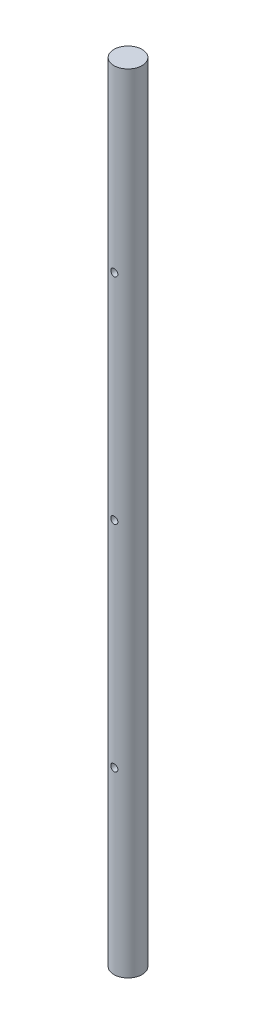
ISO-10303-21;
HEADER;
FILE_DESCRIPTION(('STEP AP214'),'2;1');
FILE_NAME('part.step','',(''),(''),'','','');
FILE_SCHEMA(('AUTOMOTIVE_DESIGN { 1 0 10303 214 1 1 1 1 }'));
ENDSEC;
DATA;
#1=APPLICATION_CONTEXT('core data for automotive mechanical design processes');
#2=APPLICATION_PROTOCOL_DEFINITION('international standard','automotive_design',2000,#1);
#3=PRODUCT_CONTEXT('',#1,'mechanical');
#4=PRODUCT('Part','Part','',(#3));
#5=PRODUCT_RELATED_PRODUCT_CATEGORY('part','',(#4));
#6=PRODUCT_DEFINITION_FORMATION('','',#4);
#7=PRODUCT_DEFINITION_CONTEXT('part definition',#1,'design');
#8=PRODUCT_DEFINITION('design','',#6,#7);
#9=PRODUCT_DEFINITION_SHAPE('','',#8);
#10=(LENGTH_UNIT() NAMED_UNIT(*) SI_UNIT(.MILLI.,.METRE.));
#11=(NAMED_UNIT(*) PLANE_ANGLE_UNIT() SI_UNIT($,.RADIAN.));
#12=(NAMED_UNIT(*) SI_UNIT($,.STERADIAN.) SOLID_ANGLE_UNIT());
#13=UNCERTAINTY_MEASURE_WITH_UNIT(LENGTH_MEASURE(1.E-05),#10,'distance_accuracy_value','');
#14=(GEOMETRIC_REPRESENTATION_CONTEXT(3) GLOBAL_UNCERTAINTY_ASSIGNED_CONTEXT((#13)) GLOBAL_UNIT_ASSIGNED_CONTEXT((#10,
#11,#12)) REPRESENTATION_CONTEXT('',''));
#15=CARTESIAN_POINT('',(0.,0.,0.));
#16=DIRECTION('',(0.,0.,1.));
#17=DIRECTION('',(1.,0.,0.));
#18=AXIS2_PLACEMENT_3D('',#15,#16,#17);
#19=CARTESIAN_POINT('',(0.,280.,0.));
#20=DIRECTION('',(0.,-1.,0.));
#21=DIRECTION('',(0.,0.,-1.));
#22=AXIS2_PLACEMENT_3D('',#19,#20,#21);
#23=CYLINDRICAL_SURFACE('',#22,5.);
#24=CARTESIAN_POINT('',(-1.25,63.75,4.84122918275927));
#25=CARTESIAN_POINT('',(-1.24999803929589,63.6809746245377,4.84123050042654));
#26=CARTESIAN_POINT('',(-1.24426312274865,63.611927550661,4.84272153006957));
#27=CARTESIAN_POINT('',(-1.22151156273207,63.475816210913,4.84850930996624));
#28=CARTESIAN_POINT('',(-1.2044883533711,63.4087531227658,4.85280769310907));
#29=CARTESIAN_POINT('',(-1.15974559981598,63.2785982309065,4.86369362297984));
#30=CARTESIAN_POINT('',(-1.13203986392723,63.2155014223072,4.87027821345204));
#31=CARTESIAN_POINT('',(-1.0667605706307,63.09484457373,4.88499096014404));
#32=CARTESIAN_POINT('',(-1.02918659428034,63.0372847689599,4.89311918189251));
#33=CARTESIAN_POINT('',(-0.944354213655933,62.9280691773689,4.91020358177806));
#34=CARTESIAN_POINT('',(-0.89691844385202,62.876553199825,4.91917298811515));
#35=CARTESIAN_POINT('',(-0.794091032050329,62.7821193028198,4.93681437757649));
#36=CARTESIAN_POINT('',(-0.738698647090153,62.7392021871891,4.94548633283195));
#37=CARTESIAN_POINT('',(-0.620572600539478,62.6626122661844,4.96170207760291));
#38=CARTESIAN_POINT('',(-0.55774728809756,62.6290768059193,4.96922843700296));
#39=CARTESIAN_POINT('',(-0.427131592146382,62.5730951779234,4.98215405962992));
#40=CARTESIAN_POINT('',(-0.359341942895973,62.5506473740422,4.98755363667172));
#41=CARTESIAN_POINT('',(-0.222179379377086,62.5179260827107,4.9955237942409));
#42=CARTESIAN_POINT('',(-0.152866359774494,62.5074151778367,4.99814946922157));
#43=CARTESIAN_POINT('',(-0.0134144096313922,62.4981208103622,5.00046797053649));
#44=CARTESIAN_POINT('',(0.0567243972690267,62.4993356138952,5.00016123048352));
#45=CARTESIAN_POINT('',(0.194190308965478,62.5132874251251,4.99669047476767));
#46=CARTESIAN_POINT('',(0.26154526950133,62.5257681625269,4.99359001170437));
#47=CARTESIAN_POINT('',(0.393172809267105,62.5614856350243,4.98495418262427));
#48=CARTESIAN_POINT('',(0.457445224213044,62.5847229426887,4.9794186869922));
#49=CARTESIAN_POINT('',(0.581758379377254,62.6415012853435,4.96643754850448));
#50=CARTESIAN_POINT('',(0.641755637208127,62.6751335223309,4.95897509847527));
#51=CARTESIAN_POINT('',(0.755344527925607,62.7516778395581,4.94294951904825));
#52=CARTESIAN_POINT('',(0.808935043856876,62.7945915342803,4.93438619826245));
#53=CARTESIAN_POINT('',(0.909717543856186,62.8898543709912,4.9168185688476));
#54=CARTESIAN_POINT('',(0.956697098843988,62.9424274461739,4.90780859762959));
#55=CARTESIAN_POINT('',(1.04122046995377,63.0547999867701,4.89057521758353));
#56=CARTESIAN_POINT('',(1.07876384505752,63.1145997897455,4.88235184552985));
#57=CARTESIAN_POINT('',(1.14348516127825,63.2401450170745,4.86760248415824));
#58=CARTESIAN_POINT('',(1.17061195871311,63.3059178651566,4.8610849186286));
#59=CARTESIAN_POINT('',(1.21335702579543,63.4412927340382,4.85059320069979));
#60=CARTESIAN_POINT('',(1.22897775819114,63.5108939319916,4.84661850405109));
#61=CARTESIAN_POINT('',(1.24791481933259,63.6499797507616,4.8417767801957));
#62=CARTESIAN_POINT('',(1.25154523695981,63.7194188966648,4.84083044546824));
#63=CARTESIAN_POINT('',(1.24725849525777,63.8579109682891,4.8419367174052));
#64=CARTESIAN_POINT('',(1.2393423989244,63.9269639289756,4.84398904800633));
#65=CARTESIAN_POINT('',(1.21246273196883,64.0615571324773,4.8507854097728));
#66=CARTESIAN_POINT('',(1.19368203414088,64.1271363632854,4.85548485117187));
#67=CARTESIAN_POINT('',(1.14580904083531,64.2542157289258,4.86700359135481));
#68=CARTESIAN_POINT('',(1.11671552385628,64.3157153795277,4.87382314124307));
#69=CARTESIAN_POINT('',(1.04838533396829,64.4342206389337,4.88898068546631));
#70=CARTESIAN_POINT('',(1.00896087691782,64.4911144200215,4.89734584303321));
#71=CARTESIAN_POINT('',(0.921325366168079,64.5975941814007,4.91458541535858));
#72=CARTESIAN_POINT('',(0.873112868506807,64.647178958325,4.92345991364235));
#73=CARTESIAN_POINT('',(0.767828401230913,64.7389055212855,4.94098701515803));
#74=CARTESIAN_POINT('',(0.710564940664495,64.7808300312744,4.94962851030918));
#75=CARTESIAN_POINT('',(0.589628353368347,64.8544679334756,4.96548608306867));
#76=CARTESIAN_POINT('',(0.525955561196992,64.8861818583041,4.9727022350198));
#77=CARTESIAN_POINT('',(0.394447752163868,64.938223017264,4.98485057869157));
#78=CARTESIAN_POINT('',(0.326646726284859,64.9586321421895,4.98979915011205));
#79=CARTESIAN_POINT('',(0.188437200398519,64.9877301673042,4.99692646697894));
#80=CARTESIAN_POINT('',(0.118029206301564,64.9964213293695,4.99910574696704));
#81=CARTESIAN_POINT('',(-0.0213544080541482,65.0017094869694,5.00042711761014));
#82=CARTESIAN_POINT('',(-0.0903172837075322,64.9986271363692,4.9996497360001));
#83=CARTESIAN_POINT('',(-0.226709370518417,64.9811902158821,4.9953237057178));
#84=CARTESIAN_POINT('',(-0.294138627226102,64.9668359812336,4.99177513946369));
#85=CARTESIAN_POINT('',(-0.425213794556015,64.9274347252863,4.98231791067453));
#86=CARTESIAN_POINT('',(-0.488878118226268,64.9024456833567,4.97642205628333));
#87=CARTESIAN_POINT('',(-0.611146316301831,64.8425367762258,4.9628911114173));
#88=CARTESIAN_POINT('',(-0.669749551581312,64.807615659163,4.9552558017217));
#89=CARTESIAN_POINT('',(-0.781752410529871,64.7278559575037,4.93884062101666));
#90=CARTESIAN_POINT('',(-0.834993735375724,64.6827998213658,4.93003771182014));
#91=CARTESIAN_POINT('',(-0.933268775339063,64.5844714350328,4.91238311316553));
#92=CARTESIAN_POINT('',(-0.978300406335232,64.5311971048776,4.90353141190695));
#93=CARTESIAN_POINT('',(-1.05970253309903,64.4167482322483,4.88659344825685));
#94=CARTESIAN_POINT('',(-1.09589577430819,64.3554448457342,4.87852454662356));
#95=CARTESIAN_POINT('',(-1.15740862076958,64.2274306375966,4.8642994443827));
#96=CARTESIAN_POINT('',(-1.18273613719965,64.1607237923666,4.85814185308378));
#97=CARTESIAN_POINT('',(-1.2180281607068,64.0367787352166,4.84939885924729));
#98=CARTESIAN_POINT('',(-1.22999146324423,63.9801335445202,4.84635828750683));
#99=CARTESIAN_POINT('',(-1.24597786571659,63.86566391375,4.84227298231965));
#100=CARTESIAN_POINT('',(-1.25000164296523,63.8078395746937,4.84122807862454));
#101=CARTESIAN_POINT('',(-1.25,63.75,4.84122918275927));
#102=B_SPLINE_CURVE_WITH_KNOTS('',3,(#24,#25,#26,#27,#28,#29,#30,#31,#32,#33,#34,#35,#36,#37,
#38,#39,#40,#41,#42,#43,#44,#45,#46,#47,#48,#49,#50,#51,#52,#53,#54,#55,#56,#57,#58,#59,#60,#61,
#62,#63,#64,#65,#66,#67,#68,#69,#70,#71,#72,#73,#74,#75,#76,#77,#78,#79,#80,#81,#82,#83,#84,#85,
#86,#87,#88,#89,#90,#91,#92,#93,#94,#95,#96,#97,#98,#99,#100,#101),.UNSPECIFIED.,.T.,.F.,(4,2,2,
2,2,2,2,2,2,2,2,2,2,2,2,2,2,2,2,2,2,2,2,2,2,2,2,2,2,2,2,2,2,2,2,2,2,2,4),(0.,0.206863720868061,
0.413847870714327,0.620565363583011,0.827291633777402,1.03811977096488,1.24896760739933,
1.46275748198961,1.67651579923546,1.88594375497673,2.0953407433301,2.30009131344473,
2.50485278362393,2.71146437127222,2.91811192734456,3.13035233285953,3.34260265599901,
3.55588216004201,3.76911600064774,3.97671787380859,4.184300635919,4.38848702504603,
4.59269760710707,4.80091422929578,5.00916509442522,5.2226266548266,5.43607707859776,
5.64796036403464,5.85980274454518,6.06591723063728,6.2720255868849,6.47702438279855,
6.68204902869036,6.89198548291035,7.10197515782755,7.31588238642339,7.5296336068331,
7.70298913588666,7.87632987549761),.UNSPECIFIED.);
#103=CARTESIAN_POINT('',(-1.25,63.75,4.84122918275927));
#104=VERTEX_POINT('',#103);
#105=EDGE_CURVE('E84',#104,#104,#102,.T.);
#106=ORIENTED_EDGE('',*,*,#105,.F.);
#107=EDGE_LOOP('',(#106));
#108=FACE_BOUND('',#107,.T.);
#109=CARTESIAN_POINT('',(-1.25,140.,4.84122918275927));
#110=CARTESIAN_POINT('',(-1.24999803929589,139.930974624538,4.84123050042654));
#111=CARTESIAN_POINT('',(-1.24426312274865,139.861927550661,4.84272153006957));
#112=CARTESIAN_POINT('',(-1.22151156273207,139.725816210913,4.84850930996624));
#113=CARTESIAN_POINT('',(-1.20448835337109,139.658753122766,4.85280769310907));
#114=CARTESIAN_POINT('',(-1.15974559981597,139.528598230906,4.86369362297984));
#115=CARTESIAN_POINT('',(-1.13203986392723,139.465501422307,4.87027821345204));
#116=CARTESIAN_POINT('',(-1.0667605706307,139.34484457373,4.88499096014404));
#117=CARTESIAN_POINT('',(-1.02918659428034,139.28728476896,4.89311918189251));
#118=CARTESIAN_POINT('',(-0.944354213655914,139.178069177369,4.91020358177806));
#119=CARTESIAN_POINT('',(-0.896918443851989,139.126553199825,4.91917298811516));
#120=CARTESIAN_POINT('',(-0.79409103205029,139.03211930282,4.93681437757649));
#121=CARTESIAN_POINT('',(-0.738698647090118,138.989202187189,4.94548633283195));
#122=CARTESIAN_POINT('',(-0.620572600539448,138.912612266184,4.96170207760291));
#123=CARTESIAN_POINT('',(-0.55774728809753,138.879076805919,4.96922843700296));
#124=CARTESIAN_POINT('',(-0.427131592146347,138.823095177923,4.98215405962992));
#125=CARTESIAN_POINT('',(-0.359341942895932,138.800647374042,4.98755363667173));
#126=CARTESIAN_POINT('',(-0.222179379377039,138.767926082711,4.9955237942409));
#127=CARTESIAN_POINT('',(-0.152866359774448,138.757415177837,4.99814946922157));
#128=CARTESIAN_POINT('',(-0.0134144096313476,138.748120810362,5.00046797053649));
#129=CARTESIAN_POINT('',(0.0567243972690697,138.749335613895,5.00016123048352));
#130=CARTESIAN_POINT('',(0.194190308965517,138.763287425125,4.99669047476767));
#131=CARTESIAN_POINT('',(0.261545269501366,138.775768162527,4.99359001170437));
#132=CARTESIAN_POINT('',(0.393172809267139,138.811485635024,4.98495418262427));
#133=CARTESIAN_POINT('',(0.457445224213079,138.834722942689,4.9794186869922));
#134=CARTESIAN_POINT('',(0.581758379377283,138.891501285344,4.96643754850447));
#135=CARTESIAN_POINT('',(0.641755637208149,138.925133522331,4.95897509847526));
#136=CARTESIAN_POINT('',(0.755344527925625,139.001677839558,4.94294951904824));
#137=CARTESIAN_POINT('',(0.808935043856899,139.04459153428,4.93438619826245));
#138=CARTESIAN_POINT('',(0.909717543856203,139.139854370991,4.9168185688476));
#139=CARTESIAN_POINT('',(0.956697098843997,139.192427446174,4.90780859762959));
#140=CARTESIAN_POINT('',(1.04122046995377,139.30479998677,4.89057521758353));
#141=CARTESIAN_POINT('',(1.07876384505752,139.364599789746,4.88235184552985));
#142=CARTESIAN_POINT('',(1.14348516127826,139.490145017075,4.86760248415824));
#143=CARTESIAN_POINT('',(1.17061195871312,139.555917865157,4.8610849186286));
#144=CARTESIAN_POINT('',(1.21335702579544,139.691292734038,4.85059320069978));
#145=CARTESIAN_POINT('',(1.22897775819115,139.760893931992,4.84661850405109));
#146=CARTESIAN_POINT('',(1.24791481933259,139.899979750762,4.8417767801957));
#147=CARTESIAN_POINT('',(1.25154523695981,139.969418896665,4.84083044546824));
#148=CARTESIAN_POINT('',(1.24725849525778,140.107910968289,4.8419367174052));
#149=CARTESIAN_POINT('',(1.2393423989244,140.176963928976,4.84398904800633));
#150=CARTESIAN_POINT('',(1.21246273196883,140.311557132477,4.8507854097728));
#151=CARTESIAN_POINT('',(1.19368203414087,140.377136363285,4.85548485117188));
#152=CARTESIAN_POINT('',(1.14580904083531,140.504215728926,4.86700359135481));
#153=CARTESIAN_POINT('',(1.11671552385627,140.565715379528,4.87382314124307));
#154=CARTESIAN_POINT('',(1.04838533396827,140.684220638934,4.88898068546632));
#155=CARTESIAN_POINT('',(1.0089608769178,140.741114420022,4.89734584303321));
#156=CARTESIAN_POINT('',(0.921325366168039,140.847594181401,4.91458541535859));
#157=CARTESIAN_POINT('',(0.873112868506763,140.897178958325,4.92345991364236));
#158=CARTESIAN_POINT('',(0.767828401230859,140.988905521286,4.94098701515804));
#159=CARTESIAN_POINT('',(0.71056494066444,141.030830031274,4.94962851030918));
#160=CARTESIAN_POINT('',(0.589628353368294,141.104467933476,4.96548608306868));
#161=CARTESIAN_POINT('',(0.525955561196943,141.136181858304,4.97270223501981));
#162=CARTESIAN_POINT('',(0.394447752163826,141.188223017264,4.98485057869157));
#163=CARTESIAN_POINT('',(0.326646726284819,141.20863214219,4.98979915011205));
#164=CARTESIAN_POINT('',(0.188437200398483,141.237730167304,4.99692646697894));
#165=CARTESIAN_POINT('',(0.11802920630153,141.24642132937,4.99910574696704));
#166=CARTESIAN_POINT('',(-0.0213544080541821,141.251709486969,5.00042711761014));
#167=CARTESIAN_POINT('',(-0.0903172837075666,141.248627136369,4.9996497360001));
#168=CARTESIAN_POINT('',(-0.226709370518452,141.231190215882,4.99532370571779));
#169=CARTESIAN_POINT('',(-0.294138627226137,141.216835981234,4.99177513946369));
#170=CARTESIAN_POINT('',(-0.425213794556048,141.177434725286,4.98231791067453));
#171=CARTESIAN_POINT('',(-0.4888781182263,141.152445683357,4.97642205628332));
#172=CARTESIAN_POINT('',(-0.61114631630186,141.092536776226,4.9628911114173));
#173=CARTESIAN_POINT('',(-0.669749551581339,141.057615659163,4.9552558017217));
#174=CARTESIAN_POINT('',(-0.781752410529897,140.977855957504,4.93884062101666));
#175=CARTESIAN_POINT('',(-0.834993735375754,140.932799821366,4.93003771182014));
#176=CARTESIAN_POINT('',(-0.933268775339092,140.834471435033,4.91238311316552));
#177=CARTESIAN_POINT('',(-0.978300406335258,140.781197104878,4.90353141190694));
#178=CARTESIAN_POINT('',(-1.05970253309906,140.666748232248,4.88659344825685));
#179=CARTESIAN_POINT('',(-1.09589577430821,140.605444845734,4.87852454662355));
#180=CARTESIAN_POINT('',(-1.1574086207696,140.477430637597,4.86429944438269));
#181=CARTESIAN_POINT('',(-1.18273613719966,140.410723792367,4.85814185308378));
#182=CARTESIAN_POINT('',(-1.2180281607068,140.286778735217,4.84939885924729));
#183=CARTESIAN_POINT('',(-1.22999146324423,140.23013354452,4.84635828750683));
#184=CARTESIAN_POINT('',(-1.24597786571659,140.11566391375,4.84227298231965));
#185=CARTESIAN_POINT('',(-1.25000164296523,140.057839574694,4.84122807862454));
#186=CARTESIAN_POINT('',(-1.25,140.,4.84122918275927));
#187=B_SPLINE_CURVE_WITH_KNOTS('',3,(#109,#110,#111,#112,#113,#114,#115,#116,#117,#118,#119,
#120,#121,#122,#123,#124,#125,#126,#127,#128,#129,#130,#131,#132,#133,#134,#135,#136,#137,#138,
#139,#140,#141,#142,#143,#144,#145,#146,#147,#148,#149,#150,#151,#152,#153,#154,#155,#156,#157,
#158,#159,#160,#161,#162,#163,#164,#165,#166,#167,#168,#169,#170,#171,#172,#173,#174,#175,#176,
#177,#178,#179,#180,#181,#182,#183,#184,#185,#186),.UNSPECIFIED.,.T.,.F.,(4,2,2,2,2,2,2,2,2,2,2,
2,2,2,2,2,2,2,2,2,2,2,2,2,2,2,2,2,2,2,2,2,2,2,2,2,2,2,4),(0.,0.206863720868089,
0.413847870714357,0.620565363583012,0.827291633777419,1.03811977096493,1.24896760739937,
1.46275748198963,1.6765157992355,1.88594375497677,2.09534074333013,2.30009131344477,
2.50485278362396,2.71146437127225,2.91811192734459,3.13035233285954,3.34260265599902,
3.55588216004204,3.76911600064777,3.97671787380855,4.18430063591902,4.38848702504604,
4.5926976071071,4.80091422929583,5.00916509442529,5.22262665482665,5.43607707859781,
5.64796036403468,5.85980274454521,6.06591723063731,6.27202558688493,6.47702438279858,
6.6820490286904,6.89198548291038,7.10197515782758,7.31588238642343,7.52963360683313,
7.70298913588667,7.87632987549761),.UNSPECIFIED.);
#188=CARTESIAN_POINT('',(-1.25,140.,4.84122918275927));
#189=VERTEX_POINT('',#188);
#190=EDGE_CURVE('E88',#189,#189,#187,.T.);
#191=ORIENTED_EDGE('',*,*,#190,.F.);
#192=EDGE_LOOP('',(#191));
#193=FACE_BOUND('',#192,.T.);
#194=CARTESIAN_POINT('',(-1.25,216.25,4.84122918275927));
#195=CARTESIAN_POINT('',(-1.24999803929589,216.180974624538,4.84123050042654));
#196=CARTESIAN_POINT('',(-1.24426312274865,216.111927550661,4.84272153006957));
#197=CARTESIAN_POINT('',(-1.22151156273207,215.975816210913,4.84850930996624));
#198=CARTESIAN_POINT('',(-1.20448835337109,215.908753122766,4.85280769310907));
#199=CARTESIAN_POINT('',(-1.15974559981596,215.778598230906,4.86369362297984));
#200=CARTESIAN_POINT('',(-1.13203986392722,215.715501422307,4.87027821345205));
#201=CARTESIAN_POINT('',(-1.06676057063069,215.59484457373,4.88499096014404));
#202=CARTESIAN_POINT('',(-1.02918659428033,215.53728476896,4.89311918189251));
#203=CARTESIAN_POINT('',(-0.94435421365591,215.428069177369,4.91020358177806));
#204=CARTESIAN_POINT('',(-0.896918443851983,215.376553199825,4.91917298811516));
#205=CARTESIAN_POINT('',(-0.794091032050283,215.28211930282,4.9368143775765));
#206=CARTESIAN_POINT('',(-0.738698647090112,215.239202187189,4.94548633283195));
#207=CARTESIAN_POINT('',(-0.620572600539443,215.162612266184,4.96170207760291));
#208=CARTESIAN_POINT('',(-0.557747288097523,215.129076805919,4.96922843700296));
#209=CARTESIAN_POINT('',(-0.42713159214634,215.073095177923,4.98215405962992));
#210=CARTESIAN_POINT('',(-0.359341942895928,215.050647374042,4.98755363667173));
#211=CARTESIAN_POINT('',(-0.222179379377039,215.017926082711,4.9955237942409));
#212=CARTESIAN_POINT('',(-0.152866359774446,215.007415177837,4.99814946922157));
#213=CARTESIAN_POINT('',(-0.0134144096313464,214.998120810362,5.00046797053649));
#214=CARTESIAN_POINT('',(0.0567243972690703,214.999335613895,5.00016123048352));
#215=CARTESIAN_POINT('',(0.194190308965517,215.013287425125,4.99669047476767));
#216=CARTESIAN_POINT('',(0.261545269501367,215.025768162527,4.99359001170437));
#217=CARTESIAN_POINT('',(0.393172809267139,215.061485635024,4.98495418262427));
#218=CARTESIAN_POINT('',(0.457445224213078,215.084722942689,4.9794186869922));
#219=CARTESIAN_POINT('',(0.581758379377287,215.141501285344,4.96643754850447));
#220=CARTESIAN_POINT('',(0.641755637208159,215.175133522331,4.95897509847526));
#221=CARTESIAN_POINT('',(0.755344527925635,215.251677839558,4.94294951904824));
#222=CARTESIAN_POINT('',(0.808935043856902,215.29459153428,4.93438619826245));
#223=CARTESIAN_POINT('',(0.909717543856202,215.389854370991,4.9168185688476));
#224=CARTESIAN_POINT('',(0.956697098843997,215.442427446174,4.90780859762959));
#225=CARTESIAN_POINT('',(1.04122046995377,215.55479998677,4.89057521758353));
#226=CARTESIAN_POINT('',(1.07876384505752,215.614599789746,4.88235184552985));
#227=CARTESIAN_POINT('',(1.14348516127826,215.740145017075,4.86760248415824));
#228=CARTESIAN_POINT('',(1.17061195871312,215.805917865157,4.8610849186286));
#229=CARTESIAN_POINT('',(1.21335702579544,215.941292734038,4.85059320069978));
#230=CARTESIAN_POINT('',(1.22897775819115,216.010893931992,4.84661850405109));
#231=CARTESIAN_POINT('',(1.24791481933259,216.149979750762,4.8417767801957));
#232=CARTESIAN_POINT('',(1.25154523695981,216.219418896665,4.84083044546824));
#233=CARTESIAN_POINT('',(1.24725849525777,216.357910968289,4.8419367174052));
#234=CARTESIAN_POINT('',(1.2393423989244,216.426963928976,4.84398904800633));
#235=CARTESIAN_POINT('',(1.21246273196883,216.561557132477,4.8507854097728));
#236=CARTESIAN_POINT('',(1.19368203414087,216.627136363285,4.85548485117188));
#237=CARTESIAN_POINT('',(1.14580904083531,216.754215728926,4.86700359135481));
#238=CARTESIAN_POINT('',(1.11671552385627,216.815715379528,4.87382314124307));
#239=CARTESIAN_POINT('',(1.04838533396827,216.934220638934,4.88898068546632));
#240=CARTESIAN_POINT('',(1.0089608769178,216.991114420022,4.89734584303321));
#241=CARTESIAN_POINT('',(0.921325366168039,217.097594181401,4.91458541535859));
#242=CARTESIAN_POINT('',(0.873112868506763,217.147178958325,4.92345991364236));
#243=CARTESIAN_POINT('',(0.767828401230859,217.238905521286,4.94098701515804));
#244=CARTESIAN_POINT('',(0.71056494066444,217.280830031274,4.94962851030918));
#245=CARTESIAN_POINT('',(0.589628353368294,217.354467933476,4.96548608306868));
#246=CARTESIAN_POINT('',(0.525955561196943,217.386181858304,4.97270223501981));
#247=CARTESIAN_POINT('',(0.394447752163826,217.438223017264,4.98485057869157));
#248=CARTESIAN_POINT('',(0.326646726284819,217.45863214219,4.98979915011205));
#249=CARTESIAN_POINT('',(0.188437200398483,217.487730167304,4.99692646697894));
#250=CARTESIAN_POINT('',(0.11802920630153,217.49642132937,4.99910574696704));
#251=CARTESIAN_POINT('',(-0.0213544080541821,217.501709486969,5.00042711761014));
#252=CARTESIAN_POINT('',(-0.0903172837075666,217.498627136369,4.9996497360001));
#253=CARTESIAN_POINT('',(-0.226709370518452,217.481190215882,4.99532370571779));
#254=CARTESIAN_POINT('',(-0.294138627226137,217.466835981234,4.99177513946369));
#255=CARTESIAN_POINT('',(-0.425213794556048,217.427434725286,4.98231791067453));
#256=CARTESIAN_POINT('',(-0.4888781182263,217.402445683357,4.97642205628332));
#257=CARTESIAN_POINT('',(-0.611146316301861,217.342536776226,4.9628911114173));
#258=CARTESIAN_POINT('',(-0.66974955158134,217.307615659163,4.9552558017217));
#259=CARTESIAN_POINT('',(-0.781752410529904,217.227855957504,4.93884062101666));
#260=CARTESIAN_POINT('',(-0.834993735375762,217.182799821366,4.93003771182013));
#261=CARTESIAN_POINT('',(-0.933268775339098,217.084471435033,4.91238311316552));
#262=CARTESIAN_POINT('',(-0.978300406335261,217.031197104878,4.90353141190694));
#263=CARTESIAN_POINT('',(-1.05970253309905,216.916748232248,4.88659344825685));
#264=CARTESIAN_POINT('',(-1.0958957743082,216.855444845734,4.87852454662355));
#265=CARTESIAN_POINT('',(-1.15740862076959,216.727430637597,4.86429944438269));
#266=CARTESIAN_POINT('',(-1.18273613719965,216.660723792367,4.85814185308378));
#267=CARTESIAN_POINT('',(-1.2180281607068,216.536778735217,4.84939885924729));
#268=CARTESIAN_POINT('',(-1.22999146324422,216.48013354452,4.84635828750683));
#269=CARTESIAN_POINT('',(-1.24597786571659,216.36566391375,4.84227298231965));
#270=CARTESIAN_POINT('',(-1.25000164296523,216.307839574694,4.84122807862454));
#271=CARTESIAN_POINT('',(-1.25,216.25,4.84122918275927));
#272=B_SPLINE_CURVE_WITH_KNOTS('',3,(#194,#195,#196,#197,#198,#199,#200,#201,#202,#203,#204,
#205,#206,#207,#208,#209,#210,#211,#212,#213,#214,#215,#216,#217,#218,#219,#220,#221,#222,#223,
#224,#225,#226,#227,#228,#229,#230,#231,#232,#233,#234,#235,#236,#237,#238,#239,#240,#241,#242,
#243,#244,#245,#246,#247,#248,#249,#250,#251,#252,#253,#254,#255,#256,#257,#258,#259,#260,#261,
#262,#263,#264,#265,#266,#267,#268,#269,#270,#271),.UNSPECIFIED.,.T.,.F.,(4,2,2,2,2,2,2,2,2,2,2,
2,2,2,2,2,2,2,2,2,2,2,2,2,2,2,2,2,2,2,2,2,2,2,2,2,2,2,4),(0.,0.206863720868089,
0.413847870714357,0.620565363583042,0.82729163377742,1.03811977096496,1.24896760739938,
1.46275748198964,1.6765157992355,1.88594375497677,2.09534074333013,2.30009131344477,
2.50485278362396,2.71146437127226,2.9181119273446,3.13035233285954,3.34260265599902,
3.55588216004204,3.76911600064778,3.97671787380858,4.18430063591902,4.38848702504604,
4.5926976071071,4.80091422929583,5.00916509442529,5.22262665482665,5.43607707859781,
5.64796036403468,5.85980274454521,6.06591723063731,6.27202558688493,6.47702438279858,
6.6820490286904,6.89198548291041,7.10197515782758,7.3158823864234,7.52963360683313,
7.70298913588664,7.87632987549761),.UNSPECIFIED.);
#273=CARTESIAN_POINT('',(-1.25,216.25,4.84122918275927));
#274=VERTEX_POINT('',#273);
#275=EDGE_CURVE('E50',#274,#274,#272,.T.);
#276=ORIENTED_EDGE('',*,*,#275,.F.);
#277=EDGE_LOOP('',(#276));
#278=FACE_BOUND('',#277,.T.);
#279=CARTESIAN_POINT('',(0.,280.,0.));
#280=DIRECTION('',(0.,1.,0.));
#281=DIRECTION('',(0.,0.,1.));
#282=AXIS2_PLACEMENT_3D('',#279,#280,#281);
#283=CIRCLE('',#282,5.);
#284=CARTESIAN_POINT('',(0.,280.,5.));
#285=VERTEX_POINT('',#284);
#286=EDGE_CURVE('E10',#285,#285,#283,.T.);
#287=ORIENTED_EDGE('',*,*,#286,.F.);
#288=EDGE_LOOP('',(#287));
#289=FACE_BOUND('',#288,.T.);
#290=CARTESIAN_POINT('',(0.,0.,0.));
#291=DIRECTION('',(0.,1.,0.));
#292=DIRECTION('',(0.,0.,1.));
#293=AXIS2_PLACEMENT_3D('',#290,#291,#292);
#294=CIRCLE('',#293,5.);
#295=CARTESIAN_POINT('',(0.,0.,5.));
#296=VERTEX_POINT('',#295);
#297=EDGE_CURVE('E42',#296,#296,#294,.T.);
#298=ORIENTED_EDGE('',*,*,#297,.T.);
#299=EDGE_LOOP('',(#298));
#300=FACE_BOUND('',#299,.T.);
#301=CARTESIAN_POINT('',(0.,217.5,-5.));
#302=CARTESIAN_POINT('',(0.0690634072247751,217.499998061885,-4.99999883223344));
#303=CARTESIAN_POINT('',(0.138148464858967,217.494257041022,-4.99855481776523));
#304=CARTESIAN_POINT('',(0.27433860314211,217.471479040578,-4.99293428191577));
#305=CARTESIAN_POINT('',(0.341442539058951,217.454435658718,-4.98875621183307));
#306=CARTESIAN_POINT('',(0.471684060152151,217.409633955448,-4.97813021943366));
#307=CARTESIAN_POINT('',(0.534826302858337,217.381888501071,-4.97168502368406));
#308=CARTESIAN_POINT('',(0.655560109920352,217.316515508296,-4.95721119839661));
#309=CARTESIAN_POINT('',(0.713151486957295,217.278887636568,-4.94918251545042));
#310=CARTESIAN_POINT('',(0.822334939417428,217.193999341955,-4.93222844659834));
#311=CARTESIAN_POINT('',(0.87379640838422,217.146573687534,-4.92328922623778));
#312=CARTESIAN_POINT('',(0.968124106002748,217.043789829243,-4.90561350097941));
#313=CARTESIAN_POINT('',(1.01098936412428,216.988430730878,-4.89687701906957));
#314=CARTESIAN_POINT('',(1.0875221189992,216.870337311052,-4.88045646416425));
#315=CARTESIAN_POINT('',(1.12104351327113,216.807505640991,-4.87278995392171));
#316=CARTESIAN_POINT('',(1.17699742379211,216.676876323618,-4.85957912343519));
#317=CARTESIAN_POINT('',(1.19943171286611,216.609079472229,-4.85403446393991));
#318=CARTESIAN_POINT('',(1.23212903067025,216.471880418165,-4.84583730597959));
#319=CARTESIAN_POINT('',(1.24262689027778,216.402537586625,-4.84312909229521));
#320=CARTESIAN_POINT('',(1.25188481255654,216.263026192488,-4.84074468781451));
#321=CARTESIAN_POINT('',(1.25064678484831,216.192857766085,-4.8410680037387));
#322=CARTESIAN_POINT('',(1.2366554371994,216.05548682688,-4.84466004580515));
#323=CARTESIAN_POINT('',(1.22418195015877,215.988253648779,-4.84785719168233));
#324=CARTESIAN_POINT('',(1.18852015575259,215.856865790907,-4.85672258063736));
#325=CARTESIAN_POINT('',(1.16533108505785,215.792711330809,-4.8623909997558));
#326=CARTESIAN_POINT('',(1.10865789828095,215.668551653123,-4.87562594920156));
#327=CARTESIAN_POINT('',(1.07507222269408,215.608594856842,-4.88321106224518));
#328=CARTESIAN_POINT('',(0.998630230012451,215.495067741869,-4.89941425705322));
#329=CARTESIAN_POINT('',(0.955772290674027,215.441498543277,-4.90803251945613));
#330=CARTESIAN_POINT('',(0.860552853901015,215.340663653588,-4.92563233783151));
#331=CARTESIAN_POINT('',(0.807955215138214,215.293621258282,-4.93461724564976));
#332=CARTESIAN_POINT('',(0.695509931253079,215.208982297947,-4.95171637982321));
#333=CARTESIAN_POINT('',(0.635662064756617,215.171386021447,-4.95983057957846));
#334=CARTESIAN_POINT('',(0.51009657390116,215.10662451148,-4.97431443411819));
#335=CARTESIAN_POINT('',(0.44435949434052,215.079495549788,-4.98067800106438));
#336=CARTESIAN_POINT('',(0.309063340119071,215.036735578575,-4.99089930826182));
#337=CARTESIAN_POINT('',(0.239504999292073,215.021102369652,-4.99475752782734));
#338=CARTESIAN_POINT('',(0.100449975325026,215.002118695368,-4.99946249392812));
#339=CARTESIAN_POINT('',(0.0309972666568456,214.998464144937,-5.00038377923565));
#340=CARTESIAN_POINT('',(-0.107527395667919,215.002707501713,-4.99932337345376));
#341=CARTESIAN_POINT('',(-0.176599383037158,215.010604368999,-4.99734194368205));
#342=CARTESIAN_POINT('',(-0.311345223980409,215.037475756993,-4.99074650939464));
#343=CARTESIAN_POINT('',(-0.377054265807299,215.056284386231,-4.98617195154843));
#344=CARTESIAN_POINT('',(-0.504381077043762,215.104255903357,-4.97490588861778));
#345=CARTESIAN_POINT('',(-0.565998432527194,215.133419836928,-4.9682141697491));
#346=CARTESIAN_POINT('',(-0.684602612024874,215.201863440729,-4.95327756605259));
#347=CARTESIAN_POINT('',(-0.741487868196533,215.241313426997,-4.94500722805777));
#348=CARTESIAN_POINT('',(-0.847938844702713,215.328991590664,-4.92787090989516));
#349=CARTESIAN_POINT('',(-0.897503299144175,215.377221283014,-4.91900482709754));
#350=CARTESIAN_POINT('',(-0.989158806727272,215.482501634037,-4.90140797467309));
#351=CARTESIAN_POINT('',(-1.03103655635169,215.539739752502,-4.89268586822734));
#352=CARTESIAN_POINT('',(-1.10459229917725,215.660610528721,-4.87660731981032));
#353=CARTESIAN_POINT('',(-1.13627074513161,215.724242902466,-4.86925081722522));
#354=CARTESIAN_POINT('',(-1.18829285050774,215.855754768678,-4.85681745612221));
#355=CARTESIAN_POINT('',(-1.20870366387838,215.923606356953,-4.85172712743255));
#356=CARTESIAN_POINT('',(-1.23778804996148,216.061924698241,-4.84438953408486));
#357=CARTESIAN_POINT('',(-1.24646418956555,216.13239087586,-4.84214164766613));
#358=CARTESIAN_POINT('',(-1.25169882527833,216.271767519879,-4.84079084336631));
#359=CARTESIAN_POINT('',(-1.2485982481501,216.340664529271,-4.8415994394022));
#360=CARTESIAN_POINT('',(-1.23114773192739,216.476919907223,-4.84606590839869));
#361=CARTESIAN_POINT('',(-1.21679801890565,216.544278306678,-4.8497237240988));
#362=CARTESIAN_POINT('',(-1.17744276620233,216.675173715888,-4.85942717235602));
#363=CARTESIAN_POINT('',(-1.15250117056698,216.7387310877,-4.86545846030258));
#364=CARTESIAN_POINT('',(-1.09272076133757,216.860804485595,-4.8792312977069));
#365=CARTESIAN_POINT('',(-1.0578805750285,216.919319810989,-4.88697308433977));
#366=CARTESIAN_POINT('',(-0.978223123864291,217.031295524168,-4.90354695219593));
#367=CARTESIAN_POINT('',(-0.933169302426887,217.084584227853,-4.91240220693131));
#368=CARTESIAN_POINT('',(-0.834824475991452,217.182955870663,-4.93006689371905));
#369=CARTESIAN_POINT('',(-0.781531517717628,217.228036858428,-4.93887631439216));
#370=CARTESIAN_POINT('',(-0.667056322252167,217.309509423804,-4.95564713039719));
#371=CARTESIAN_POINT('',(-0.605748685263665,217.345728844726,-4.9635902780489));
#372=CARTESIAN_POINT('',(-0.477721716258741,217.40728955245,-4.97754104145932));
#373=CARTESIAN_POINT('',(-0.411006302863961,217.432638633874,-4.98355004333151));
#374=CARTESIAN_POINT('',(-0.28700854436957,217.467976525275,-4.99206716304618));
#375=CARTESIAN_POINT('',(-0.230316809090066,217.479959369211,-4.99502154210576));
#376=CARTESIAN_POINT('',(-0.115755059613575,217.495971619685,-4.9989883769329));
#377=CARTESIAN_POINT('',(-0.0578851343688494,217.500001624421,-5.00000097875745));
#378=CARTESIAN_POINT('',(0.,217.5,-5.));
#379=B_SPLINE_CURVE_WITH_KNOTS('',3,(#301,#302,#303,#304,#305,#306,#307,#308,#309,#310,#311,
#312,#313,#314,#315,#316,#317,#318,#319,#320,#321,#322,#323,#324,#325,#326,#327,#328,#329,#330,
#331,#332,#333,#334,#335,#336,#337,#338,#339,#340,#341,#342,#343,#344,#345,#346,#347,#348,#349,
#350,#351,#352,#353,#354,#355,#356,#357,#358,#359,#360,#361,#362,#363,#364,#365,#366,#367,#368,
#369,#370,#371,#372,#373,#374,#375,#376,#377,#378),.UNSPECIFIED.,.T.,.F.,(4,2,2,2,2,2,2,2,2,2,2,
2,2,2,2,2,2,2,2,2,2,2,2,2,2,2,2,2,2,2,2,2,2,2,2,2,2,2,4),(0.,0.206978093726575,
0.414073531469911,0.620920751905094,0.8277749501411,1.03845362864282,1.24915607983383,
1.46298872954841,1.67678717641141,1.88630245916194,2.09578365093914,2.30018747505847,
2.50460586221699,2.71108773228237,2.91760575696803,3.13001250807517,3.34242574631872,
3.55556857507595,3.76867061407202,3.97631924124397,4.18394917593952,4.38850228761698,
4.59307606101909,4.80127989637795,5.00951969173349,5.22287091003729,5.43621265624592,
5.64826878845029,5.8602785271034,6.06619816998841,6.2721136746336,6.47680333799539,
6.68152140114083,6.89157980341591,7.10168808142015,7.3156015458299,7.52936136517791,
7.70285202451791,7.876329633692),.UNSPECIFIED.);
#380=CARTESIAN_POINT('',(0.,217.5,-5.));
#381=VERTEX_POINT('',#380);
#382=EDGE_CURVE('E47',#381,#381,#379,.T.);
#383=ORIENTED_EDGE('',*,*,#382,.F.);
#384=EDGE_LOOP('',(#383));
#385=FACE_BOUND('',#384,.T.);
#386=CARTESIAN_POINT('',(0.,141.25,-5.));
#387=CARTESIAN_POINT('',(0.069063407224775,141.249998061885,-4.99999883223344));
#388=CARTESIAN_POINT('',(0.138148464858967,141.244257041022,-4.99855481776523));
#389=CARTESIAN_POINT('',(0.27433860314211,141.221479040577,-4.99293428191577));
#390=CARTESIAN_POINT('',(0.341442539058952,141.204435658718,-4.98875621183307));
#391=CARTESIAN_POINT('',(0.471684060152147,141.159633955448,-4.97813021943367));
#392=CARTESIAN_POINT('',(0.534826302858328,141.131888501071,-4.97168502368406));
#393=CARTESIAN_POINT('',(0.655560109920344,141.066515508296,-4.95721119839661));
#394=CARTESIAN_POINT('',(0.713151486957292,141.028887636568,-4.94918251545042));
#395=CARTESIAN_POINT('',(0.822334939417428,140.943999341955,-4.93222844659834));
#396=CARTESIAN_POINT('',(0.87379640838422,140.896573687534,-4.92328922623777));
#397=CARTESIAN_POINT('',(0.968124106002748,140.793789829243,-4.90561350097941));
#398=CARTESIAN_POINT('',(1.01098936412428,140.738430730878,-4.89687701906957));
#399=CARTESIAN_POINT('',(1.0875221189992,140.620337311052,-4.88045646416425));
#400=CARTESIAN_POINT('',(1.12104351327113,140.557505640991,-4.87278995392171));
#401=CARTESIAN_POINT('',(1.17699742379211,140.426876323618,-4.85957912343519));
#402=CARTESIAN_POINT('',(1.19943171286611,140.359079472229,-4.85403446393991));
#403=CARTESIAN_POINT('',(1.23212903067025,140.221880418165,-4.84583730597959));
#404=CARTESIAN_POINT('',(1.24262689027779,140.152537586625,-4.84312909229521));
#405=CARTESIAN_POINT('',(1.25188481255654,140.013026192488,-4.84074468781451));
#406=CARTESIAN_POINT('',(1.25064678484831,139.942857766084,-4.8410680037387));
#407=CARTESIAN_POINT('',(1.2366554371994,139.80548682688,-4.84466004580515));
#408=CARTESIAN_POINT('',(1.22418195015877,139.738253648779,-4.84785719168233));
#409=CARTESIAN_POINT('',(1.18852015575259,139.606865790907,-4.85672258063736));
#410=CARTESIAN_POINT('',(1.16533108505785,139.542711330809,-4.8623909997558));
#411=CARTESIAN_POINT('',(1.10865789828095,139.418551653123,-4.87562594920156));
#412=CARTESIAN_POINT('',(1.07507222269408,139.358594856842,-4.88321106224518));
#413=CARTESIAN_POINT('',(0.99863023001245,139.245067741869,-4.89941425705322));
#414=CARTESIAN_POINT('',(0.955772290674026,139.191498543277,-4.90803251945613));
#415=CARTESIAN_POINT('',(0.860552853901018,139.090663653588,-4.92563233783151));
#416=CARTESIAN_POINT('',(0.807955215138224,139.043621258282,-4.93461724564976));
#417=CARTESIAN_POINT('',(0.69550993125309,138.958982297947,-4.95171637982321));
#418=CARTESIAN_POINT('',(0.635662064756622,138.921386021447,-4.95983057957846));
#419=CARTESIAN_POINT('',(0.510096573901159,138.85662451148,-4.97431443411819));
#420=CARTESIAN_POINT('',(0.44435949434052,138.829495549788,-4.98067800106438));
#421=CARTESIAN_POINT('',(0.309063340119071,138.786735578575,-4.99089930826182));
#422=CARTESIAN_POINT('',(0.239504999292073,138.771102369652,-4.99475752782734));
#423=CARTESIAN_POINT('',(0.100449975325026,138.752118695368,-4.99946249392812));
#424=CARTESIAN_POINT('',(0.030997266656845,138.748464144937,-5.00038377923565));
#425=CARTESIAN_POINT('',(-0.10752739566792,138.752707501713,-4.99932337345376));
#426=CARTESIAN_POINT('',(-0.176599383037159,138.760604368999,-4.99734194368205));
#427=CARTESIAN_POINT('',(-0.311345223980409,138.787475756993,-4.99074650939464));
#428=CARTESIAN_POINT('',(-0.377054265807299,138.806284386231,-4.98617195154843));
#429=CARTESIAN_POINT('',(-0.504381077043762,138.854255903357,-4.97490588861778));
#430=CARTESIAN_POINT('',(-0.565998432527195,138.883419836928,-4.9682141697491));
#431=CARTESIAN_POINT('',(-0.684602612024869,138.951863440729,-4.95327756605259));
#432=CARTESIAN_POINT('',(-0.741487868196522,138.991313426997,-4.94500722805777));
#433=CARTESIAN_POINT('',(-0.847938844702703,139.078991590664,-4.92787090989516));
#434=CARTESIAN_POINT('',(-0.897503299144172,139.127221283014,-4.91900482709754));
#435=CARTESIAN_POINT('',(-0.989158806727279,139.232501634037,-4.90140797467309));
#436=CARTESIAN_POINT('',(-1.0310365563517,139.289739752502,-4.89268586822734));
#437=CARTESIAN_POINT('',(-1.10459229917725,139.410610528721,-4.87660731981032));
#438=CARTESIAN_POINT('',(-1.13627074513161,139.474242902467,-4.86925081722522));
#439=CARTESIAN_POINT('',(-1.18829285050774,139.605754768678,-4.85681745612221));
#440=CARTESIAN_POINT('',(-1.20870366387839,139.673606356953,-4.85172712743255));
#441=CARTESIAN_POINT('',(-1.23778804996149,139.811924698241,-4.84438953408486));
#442=CARTESIAN_POINT('',(-1.24646418956555,139.88239087586,-4.84214164766613));
#443=CARTESIAN_POINT('',(-1.25169882527833,140.021767519879,-4.84079084336631));
#444=CARTESIAN_POINT('',(-1.2485982481501,140.090664529271,-4.8415994394022));
#445=CARTESIAN_POINT('',(-1.23114773192739,140.226919907223,-4.84606590839869));
#446=CARTESIAN_POINT('',(-1.21679801890565,140.294278306678,-4.8497237240988));
#447=CARTESIAN_POINT('',(-1.17744276620234,140.425173715888,-4.85942717235602));
#448=CARTESIAN_POINT('',(-1.15250117056699,140.4887310877,-4.86545846030258));
#449=CARTESIAN_POINT('',(-1.09272076133757,140.610804485595,-4.8792312977069));
#450=CARTESIAN_POINT('',(-1.0578805750285,140.669319810989,-4.88697308433977));
#451=CARTESIAN_POINT('',(-0.978223123864292,140.781295524168,-4.90354695219593));
#452=CARTESIAN_POINT('',(-0.933169302426887,140.834584227853,-4.91240220693131));
#453=CARTESIAN_POINT('',(-0.834824475991452,140.932955870663,-4.93006689371905));
#454=CARTESIAN_POINT('',(-0.781531517717628,140.978036858427,-4.93887631439216));
#455=CARTESIAN_POINT('',(-0.667056322252167,141.059509423804,-4.95564713039719));
#456=CARTESIAN_POINT('',(-0.605748685263665,141.095728844726,-4.9635902780489));
#457=CARTESIAN_POINT('',(-0.477721716258741,141.15728955245,-4.97754104145932));
#458=CARTESIAN_POINT('',(-0.411006302863961,141.182638633874,-4.98355004333151));
#459=CARTESIAN_POINT('',(-0.287008544369569,141.217976525275,-4.99206716304618));
#460=CARTESIAN_POINT('',(-0.230316809090064,141.229959369211,-4.99502154210576));
#461=CARTESIAN_POINT('',(-0.115755059613572,141.245971619685,-4.9989883769329));
#462=CARTESIAN_POINT('',(-0.057885134368848,141.250001624421,-5.00000097875745));
#463=CARTESIAN_POINT('',(0.,141.25,-5.));
#464=B_SPLINE_CURVE_WITH_KNOTS('',3,(#386,#387,#388,#389,#390,#391,#392,#393,#394,#395,#396,
#397,#398,#399,#400,#401,#402,#403,#404,#405,#406,#407,#408,#409,#410,#411,#412,#413,#414,#415,
#416,#417,#418,#419,#420,#421,#422,#423,#424,#425,#426,#427,#428,#429,#430,#431,#432,#433,#434,
#435,#436,#437,#438,#439,#440,#441,#442,#443,#444,#445,#446,#447,#448,#449,#450,#451,#452,#453,
#454,#455,#456,#457,#458,#459,#460,#461,#462,#463),.UNSPECIFIED.,.T.,.F.,(4,2,2,2,2,2,2,2,2,2,2,
2,2,2,2,2,2,2,2,2,2,2,2,2,2,2,2,2,2,2,2,2,2,2,2,2,2,2,4),(0.,0.206978093726575,
0.414073531469911,0.620920751905083,0.827774950141099,1.03845362864282,1.24915607983383,
1.46298872954841,1.67678717641141,1.88630245916196,2.09578365093914,2.30018747505847,
2.50460586221699,2.71108773228237,2.91760575696803,3.13001250807516,3.34242574631872,
3.55556857507595,3.76867061407202,3.97631924124397,4.18394917593952,4.38850228761698,
4.59307606101909,4.80127989637793,5.00951969173349,5.22287091003731,5.43621265624591,
5.64826878845032,5.8602785271034,6.06619816998843,6.2721136746336,6.47680333799536,
6.68152140114083,6.89157980341591,7.10168808142015,7.3156015458299,7.52936136517791,
7.70285202451791,7.876329633692),.UNSPECIFIED.);
#465=CARTESIAN_POINT('',(0.,141.25,-5.));
#466=VERTEX_POINT('',#465);
#467=EDGE_CURVE('E56',#466,#466,#464,.T.);
#468=ORIENTED_EDGE('',*,*,#467,.F.);
#469=EDGE_LOOP('',(#468));
#470=FACE_BOUND('',#469,.T.);
#471=CARTESIAN_POINT('',(0.,65.,-5.));
#472=CARTESIAN_POINT('',(0.0690634072247756,64.9999980618849,-4.99999883223344));
#473=CARTESIAN_POINT('',(0.138148464858969,64.9942570410219,-4.99855481776523));
#474=CARTESIAN_POINT('',(0.27433860314211,64.9714790405775,-4.99293428191577));
#475=CARTESIAN_POINT('',(0.341442539058949,64.9544356587185,-4.98875621183307));
#476=CARTESIAN_POINT('',(0.471684060152149,64.9096339554483,-4.97813021943366));
#477=CARTESIAN_POINT('',(0.534826302858339,64.8818885010706,-4.97168502368406));
#478=CARTESIAN_POINT('',(0.655560109920357,64.816515508296,-4.95721119839661));
#479=CARTESIAN_POINT('',(0.713151486957301,64.7788876365676,-4.94918251545042));
#480=CARTESIAN_POINT('',(0.822334939417432,64.6939993419548,-4.93222844659834));
#481=CARTESIAN_POINT('',(0.873796408384225,64.646573687534,-4.92328922623777));
#482=CARTESIAN_POINT('',(0.968124106002751,64.5437898292426,-4.90561350097941));
#483=CARTESIAN_POINT('',(1.01098936412428,64.4884307308779,-4.89687701906957));
#484=CARTESIAN_POINT('',(1.0875221189992,64.3703373110521,-4.88045646416425));
#485=CARTESIAN_POINT('',(1.12104351327114,64.3075056409913,-4.87278995392171));
#486=CARTESIAN_POINT('',(1.17699742379211,64.176876323618,-4.85957912343519));
#487=CARTESIAN_POINT('',(1.19943171286611,64.1090794722285,-4.85403446393991));
#488=CARTESIAN_POINT('',(1.23212903067024,63.9718804181646,-4.84583730597959));
#489=CARTESIAN_POINT('',(1.24262689027778,63.9025375866252,-4.84312909229522));
#490=CARTESIAN_POINT('',(1.25188481255654,63.7630261924884,-4.84074468781451));
#491=CARTESIAN_POINT('',(1.25064678484832,63.6928577660845,-4.8410680037387));
#492=CARTESIAN_POINT('',(1.2366554371994,63.5554868268796,-4.84466004580515));
#493=CARTESIAN_POINT('',(1.22418195015877,63.4882536487791,-4.84785719168233));
#494=CARTESIAN_POINT('',(1.18852015575259,63.3568657909073,-4.85672258063736));
#495=CARTESIAN_POINT('',(1.16533108505786,63.2927113308092,-4.8623909997558));
#496=CARTESIAN_POINT('',(1.10865789828097,63.1685516531233,-4.87562594920155));
#497=CARTESIAN_POINT('',(1.0750722226941,63.108594856842,-4.88321106224517));
#498=CARTESIAN_POINT('',(0.998630230012466,62.9950677418693,-4.89941425705322));
#499=CARTESIAN_POINT('',(0.955772290674036,62.9414985432773,-4.90803251945613));
#500=CARTESIAN_POINT('',(0.860552853901017,62.840663653588,-4.92563233783151));
#501=CARTESIAN_POINT('',(0.807955215138217,62.7936212582822,-4.93461724564976));
#502=CARTESIAN_POINT('',(0.695509931253082,62.7089822979467,-4.95171637982321));
#503=CARTESIAN_POINT('',(0.63566206475662,62.671386021447,-4.95983057957846));
#504=CARTESIAN_POINT('',(0.510096573901161,62.6066245114797,-4.97431443411819));
#505=CARTESIAN_POINT('',(0.444359494340519,62.579495549788,-4.98067800106438));
#506=CARTESIAN_POINT('',(0.309063340119066,62.5367355785754,-4.99089930826182));
#507=CARTESIAN_POINT('',(0.239504999292067,62.5211023696516,-4.99475752782734));
#508=CARTESIAN_POINT('',(0.100449975325018,62.5021186953676,-4.99946249392812));
#509=CARTESIAN_POINT('',(0.0309972666568379,62.4984641449372,-5.00038377923565));
#510=CARTESIAN_POINT('',(-0.107527395667925,62.5027075017129,-4.99932337345376));
#511=CARTESIAN_POINT('',(-0.176599383037164,62.5106043689993,-4.99734194368205));
#512=CARTESIAN_POINT('',(-0.311345223980411,62.5374757569928,-4.99074650939464));
#513=CARTESIAN_POINT('',(-0.377054265807297,62.5562843862308,-4.98617195154843));
#514=CARTESIAN_POINT('',(-0.504381077043762,62.604255903357,-4.97490588861778));
#515=CARTESIAN_POINT('',(-0.565998432527199,62.6334198369276,-4.9682141697491));
#516=CARTESIAN_POINT('',(-0.684602612024874,62.7018634407289,-4.95327756605259));
#517=CARTESIAN_POINT('',(-0.741487868196524,62.7413134269973,-4.94500722805777));
#518=CARTESIAN_POINT('',(-0.847938844702702,62.8289915906641,-4.92787090989516));
#519=CARTESIAN_POINT('',(-0.897503299144171,62.8772212830141,-4.91900482709754));
#520=CARTESIAN_POINT('',(-0.989158806727273,62.982501634037,-4.90140797467309));
#521=CARTESIAN_POINT('',(-1.03103655635169,63.039739752502,-4.89268586822734));
#522=CARTESIAN_POINT('',(-1.10459229917725,63.1606105287214,-4.87660731981032));
#523=CARTESIAN_POINT('',(-1.13627074513161,63.2242429024665,-4.86925081722522));
#524=CARTESIAN_POINT('',(-1.18829285050774,63.3557547686776,-4.85681745612221));
#525=CARTESIAN_POINT('',(-1.20870366387839,63.4236063569533,-4.85172712743255));
#526=CARTESIAN_POINT('',(-1.23778804996148,63.5619246982409,-4.84438953408486));
#527=CARTESIAN_POINT('',(-1.24646418956555,63.6323908758604,-4.84214164766613));
#528=CARTESIAN_POINT('',(-1.25169882527833,63.7717675198793,-4.84079084336631));
#529=CARTESIAN_POINT('',(-1.2485982481501,63.8406645292706,-4.8415994394022));
#530=CARTESIAN_POINT('',(-1.23114773192739,63.9769199072233,-4.84606590839869));
#531=CARTESIAN_POINT('',(-1.21679801890564,64.0442783066781,-4.8497237240988));
#532=CARTESIAN_POINT('',(-1.17744276620233,64.1751737158879,-4.85942717235602));
#533=CARTESIAN_POINT('',(-1.15250117056698,64.2387310877002,-4.86545846030258));
#534=CARTESIAN_POINT('',(-1.09272076133756,64.3608044855947,-4.87923129770691));
#535=CARTESIAN_POINT('',(-1.05788057502849,64.4193198109891,-4.88697308433977));
#536=CARTESIAN_POINT('',(-0.978223123864282,64.5312955241684,-4.90354695219593));
#537=CARTESIAN_POINT('',(-0.933169302426881,64.5845842278533,-4.91240220693131));
#538=CARTESIAN_POINT('',(-0.834824475991445,64.6829558706628,-4.93006689371905));
#539=CARTESIAN_POINT('',(-0.781531517717616,64.7280368584275,-4.93887631439216));
#540=CARTESIAN_POINT('',(-0.667056322252153,64.8095094238038,-4.95564713039719));
#541=CARTESIAN_POINT('',(-0.605748685263655,64.8457288447263,-4.9635902780489));
#542=CARTESIAN_POINT('',(-0.477721716258734,64.9072895524505,-4.97754104145932));
#543=CARTESIAN_POINT('',(-0.411006302863953,64.9326386338738,-4.98355004333151));
#544=CARTESIAN_POINT('',(-0.287008544369563,64.9679765252747,-4.99206716304618));
#545=CARTESIAN_POINT('',(-0.230316809090059,64.9799593692112,-4.99502154210576));
#546=CARTESIAN_POINT('',(-0.11575505961357,64.995971619685,-4.9989883769329));
#547=CARTESIAN_POINT('',(-0.0578851343688474,65.0000016244211,-5.00000097875745));
#548=CARTESIAN_POINT('',(0.,65.,-5.));
#549=B_SPLINE_CURVE_WITH_KNOTS('',3,(#471,#472,#473,#474,#475,#476,#477,#478,#479,#480,#481,
#482,#483,#484,#485,#486,#487,#488,#489,#490,#491,#492,#493,#494,#495,#496,#497,#498,#499,#500,
#501,#502,#503,#504,#505,#506,#507,#508,#509,#510,#511,#512,#513,#514,#515,#516,#517,#518,#519,
#520,#521,#522,#523,#524,#525,#526,#527,#528,#529,#530,#531,#532,#533,#534,#535,#536,#537,#538,
#539,#540,#541,#542,#543,#544,#545,#546,#547,#548),.UNSPECIFIED.,.T.,.F.,(4,2,2,2,2,2,2,2,2,2,2,
2,2,2,2,2,2,2,2,2,2,2,2,2,2,2,2,2,2,2,2,2,2,2,2,2,2,2,4),(0.,0.206978093726573,
0.414073531469917,0.620920751905097,0.827774950141105,1.03845362864282,1.24915607983385,
1.46298872954841,1.6767871764114,1.88630245916191,2.09578365093914,2.30018747505847,
2.50460586221697,2.71108773228233,2.91760575696802,3.13001250807517,3.34242574631872,
3.55556857507595,3.76867061407203,3.97631924124397,4.18394917593953,4.38850228761698,
4.59307606101909,4.80127989637793,5.00951969173348,5.22287091003729,5.43621265624591,
5.6482687884503,5.86027852710339,6.06619816998844,6.27211367463364,6.4768033379954,
6.68152140114085,6.89157980341592,7.10168808142016,7.3156015458299,7.52936136517791,
7.70285202451791,7.876329633692),.UNSPECIFIED.);
#550=CARTESIAN_POINT('',(0.,65.,-5.));
#551=VERTEX_POINT('',#550);
#552=EDGE_CURVE('E35',#551,#551,#549,.T.);
#553=ORIENTED_EDGE('',*,*,#552,.F.);
#554=EDGE_LOOP('',(#553));
#555=FACE_BOUND('',#554,.T.);
#556=ADVANCED_FACE('F31',(#108,#193,#278,#289,#300,#385,#470,#555),#23,.T.);
#557=CARTESIAN_POINT('',(0.,280.,0.));
#558=DIRECTION('',(0.,1.,0.));
#559=DIRECTION('',(0.,0.,1.));
#560=AXIS2_PLACEMENT_3D('',#557,#558,#559);
#561=PLANE('',#560);
#562=ORIENTED_EDGE('',*,*,#286,.T.);
#563=EDGE_LOOP('',(#562));
#564=FACE_BOUND('',#563,.T.);
#565=ADVANCED_FACE('F69',(#564),#561,.T.);
#566=CARTESIAN_POINT('',(0.,0.,0.));
#567=DIRECTION('',(0.,1.,0.));
#568=DIRECTION('',(0.,0.,1.));
#569=AXIS2_PLACEMENT_3D('',#566,#567,#568);
#570=PLANE('',#569);
#571=ORIENTED_EDGE('',*,*,#297,.F.);
#572=EDGE_LOOP('',(#571));
#573=FACE_BOUND('',#572,.T.);
#574=ADVANCED_FACE('F66',(#573),#570,.F.);
#575=CARTESIAN_POINT('',(0.,216.25,10.));
#576=DIRECTION('',(0.,0.,-1.));
#577=DIRECTION('',(-1.,0.,0.));
#578=AXIS2_PLACEMENT_3D('',#575,#576,#577);
#579=CYLINDRICAL_SURFACE('',#578,1.25);
#580=ORIENTED_EDGE('',*,*,#275,.T.);
#581=EDGE_LOOP('',(#580));
#582=FACE_BOUND('',#581,.T.);
#583=ORIENTED_EDGE('',*,*,#382,.T.);
#584=EDGE_LOOP('',(#583));
#585=FACE_BOUND('',#584,.T.);
#586=ADVANCED_FACE('F60',(#582,#585),#579,.F.);
#587=CARTESIAN_POINT('',(0.,140.,10.));
#588=DIRECTION('',(0.,0.,-1.));
#589=DIRECTION('',(-1.,0.,0.));
#590=AXIS2_PLACEMENT_3D('',#587,#588,#589);
#591=CYLINDRICAL_SURFACE('',#590,1.25);
#592=ORIENTED_EDGE('',*,*,#190,.T.);
#593=EDGE_LOOP('',(#592));
#594=FACE_BOUND('',#593,.T.);
#595=ORIENTED_EDGE('',*,*,#467,.T.);
#596=EDGE_LOOP('',(#595));
#597=FACE_BOUND('',#596,.T.);
#598=ADVANCED_FACE('F65',(#594,#597),#591,.F.);
#599=CARTESIAN_POINT('',(0.,63.75,10.));
#600=DIRECTION('',(0.,0.,-1.));
#601=DIRECTION('',(-1.,0.,0.));
#602=AXIS2_PLACEMENT_3D('',#599,#600,#601);
#603=CYLINDRICAL_SURFACE('',#602,1.25);
#604=ORIENTED_EDGE('',*,*,#105,.T.);
#605=EDGE_LOOP('',(#604));
#606=FACE_BOUND('',#605,.T.);
#607=ORIENTED_EDGE('',*,*,#552,.T.);
#608=EDGE_LOOP('',(#607));
#609=FACE_BOUND('',#608,.T.);
#610=ADVANCED_FACE('F108',(#606,#609),#603,.F.);
#611=CLOSED_SHELL('',(#556,#565,#574,#586,#598,#610));
#612=MANIFOLD_SOLID_BREP('B2',#611);
#613=ADVANCED_BREP_SHAPE_REPRESENTATION('',(#18,#612),#14);
#614=SHAPE_DEFINITION_REPRESENTATION(#9,#613);
ENDSEC;
END-ISO-10303-21;
